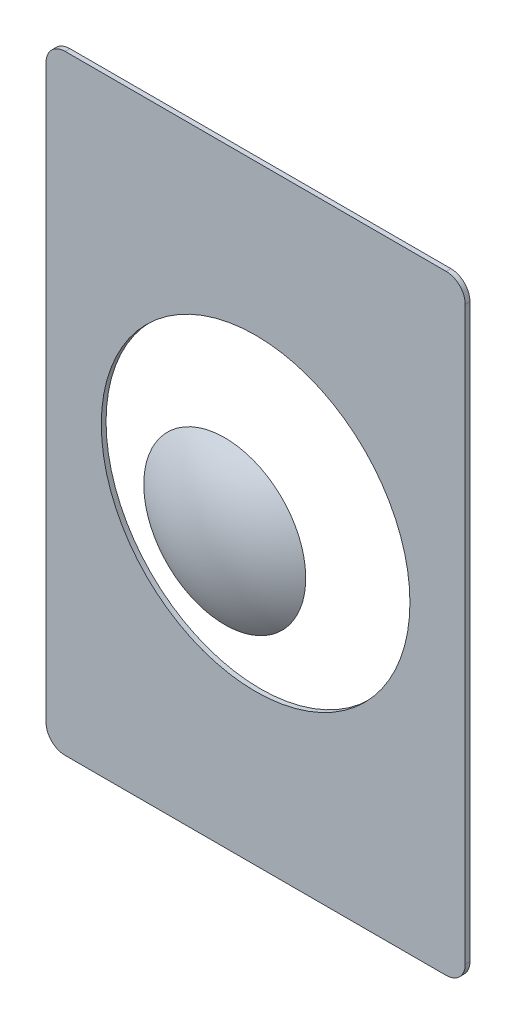
ISO-10303-21;
HEADER;
FILE_DESCRIPTION(('STEP AP214'),'2;1');
FILE_NAME('part.step','',(''),(''),'','','');
FILE_SCHEMA(('AUTOMOTIVE_DESIGN { 1 0 10303 214 1 1 1 1 }'));
ENDSEC;
DATA;
#1=APPLICATION_CONTEXT('core data for automotive mechanical design processes');
#2=APPLICATION_PROTOCOL_DEFINITION('international standard','automotive_design',2000,#1);
#3=PRODUCT_CONTEXT('',#1,'mechanical');
#4=PRODUCT('Part','Part','',(#3));
#5=PRODUCT_RELATED_PRODUCT_CATEGORY('part','',(#4));
#6=PRODUCT_DEFINITION_FORMATION('','',#4);
#7=PRODUCT_DEFINITION_CONTEXT('part definition',#1,'design');
#8=PRODUCT_DEFINITION('design','',#6,#7);
#9=PRODUCT_DEFINITION_SHAPE('','',#8);
#10=(LENGTH_UNIT() NAMED_UNIT(*) SI_UNIT(.MILLI.,.METRE.));
#11=(NAMED_UNIT(*) PLANE_ANGLE_UNIT() SI_UNIT($,.RADIAN.));
#12=(NAMED_UNIT(*) SI_UNIT($,.STERADIAN.) SOLID_ANGLE_UNIT());
#13=UNCERTAINTY_MEASURE_WITH_UNIT(LENGTH_MEASURE(1.E-05),#10,'distance_accuracy_value','');
#14=(GEOMETRIC_REPRESENTATION_CONTEXT(3) GLOBAL_UNCERTAINTY_ASSIGNED_CONTEXT((#13)) GLOBAL_UNIT_ASSIGNED_CONTEXT((#10,
#11,#12)) REPRESENTATION_CONTEXT('',''));
#15=CARTESIAN_POINT('',(0.,0.,0.));
#16=DIRECTION('',(0.,0.,1.));
#17=DIRECTION('',(1.,0.,0.));
#18=AXIS2_PLACEMENT_3D('',#15,#16,#17);
#19=CARTESIAN_POINT('',(56.999999845068,8.575004031758,0.571963767078));
#20=DIRECTION('',(0.,0.,-1.));
#21=DIRECTION('',(-1.,0.,0.));
#22=AXIS2_PLACEMENT_3D('',#19,#20,#21);
#23=PLANE('',#22);
#24=CARTESIAN_POINT('',(56.999999834932,9.42500403175785,0.571963767078002));
#25=CARTESIAN_POINT('',(56.9761411407142,9.42500207086063,0.571963767078125));
#26=CARTESIAN_POINT('',(56.9522607988355,9.42298756957891,0.571963767078101));
#27=CARTESIAN_POINT('',(56.9051372303346,9.41497322569739,0.571963767077899));
#28=CARTESIAN_POINT('',(56.8818954783837,9.40896485356885,0.571963767077719));
#29=CARTESIAN_POINT('',(56.8367896157025,9.39314177421923,0.571963767077767));
#30=CARTESIAN_POINT('',(56.8149231266397,9.3833338606323,0.571963767077994));
#31=CARTESIAN_POINT('',(56.7731164143787,9.36017191553272,0.571963767078006));
#32=CARTESIAN_POINT('',(56.7531789789575,9.34681285346851,0.571963767077792));
#33=CARTESIAN_POINT('',(56.715858133379,9.31695627620635,0.57196376707777));
#34=CARTESIAN_POINT('',(56.6984711615374,9.30046321297242,0.571963767077962));
#35=CARTESIAN_POINT('',(56.6666883958285,9.26476872042057,0.571963767078039));
#36=CARTESIAN_POINT('',(56.6522968233799,9.24556353198714,0.571963767077923));
#37=CARTESIAN_POINT('',(56.6269540245006,9.20502318314762,0.571963767077894));
#38=CARTESIAN_POINT('',(56.6160002999014,9.18368958431202,0.57196376707798));
#39=CARTESIAN_POINT('',(56.5978292625773,9.13948491669051,0.57196376707802));
#40=CARTESIAN_POINT('',(56.5906121696607,9.11661375754658,0.571963767077975));
#41=CARTESIAN_POINT('',(56.5801204378392,9.06998509477541,0.571963767077963));
#42=CARTESIAN_POINT('',(56.5768456830043,9.04622761723281,0.571963767077996));
#43=CARTESIAN_POINT('',(56.5743311912059,8.99850008006301,0.571963767078004));
#44=CARTESIAN_POINT('',(56.5750914542425,8.97453002043581,0.57196376707798));
#45=CARTESIAN_POINT('',(56.5806255075855,8.9270570504209,0.571963767077978));
#46=CARTESIAN_POINT('',(56.5853994159211,8.90355415379184,0.571963767077999));
#47=CARTESIAN_POINT('',(56.5988249688574,8.85768484198846,0.571963767078001));
#48=CARTESIAN_POINT('',(56.607476385372,8.83531836005313,0.571963767077983));
#49=CARTESIAN_POINT('',(56.628419033082,8.79233949494532,0.571963767077985));
#50=CARTESIAN_POINT('',(56.6407129127015,8.77172840219872,0.571963767078004));
#51=CARTESIAN_POINT('',(56.6685690639528,8.73289187516431,0.571963767077996));
#52=CARTESIAN_POINT('',(56.684126742539,8.71466314614486,0.571963767077969));
#53=CARTESIAN_POINT('',(56.7181037456573,8.68105029176419,0.57196376707798));
#54=CARTESIAN_POINT('',(56.7365270799551,8.66567021947045,0.571963767078018));
#55=CARTESIAN_POINT('',(56.7756685678935,8.63824357525651,0.571963767077982));
#56=CARTESIAN_POINT('',(56.796383420595,8.62619229356448,0.571963767077907));
#57=CARTESIAN_POINT('',(56.8395769407346,8.60571722320364,0.571963767077944));
#58=CARTESIAN_POINT('',(56.8620586871932,8.59729994065216,0.571963767078057));
#59=CARTESIAN_POINT('',(56.9080792613612,8.58437836298656,0.571963767077943));
#60=CARTESIAN_POINT('',(56.931615726306,8.5798657405163,0.571963767077718));
#61=CARTESIAN_POINT('',(56.9701757228216,8.57578821440278,0.571963767077791));
#62=CARTESIAN_POINT('',(56.9850835532725,8.57500280581868,0.571963767077925));
#63=CARTESIAN_POINT('',(57.0238585392858,8.57500599265536,0.571963767078124));
#64=CARTESIAN_POINT('',(57.0477388811645,8.57702049393708,0.5719637670781));
#65=CARTESIAN_POINT('',(57.0948624496654,8.58503483781861,0.5719637670779));
#66=CARTESIAN_POINT('',(57.1181042016163,8.59104320994716,0.571963767077724));
#67=CARTESIAN_POINT('',(57.1632100642975,8.60686628929678,0.571963767077772));
#68=CARTESIAN_POINT('',(57.1850765533603,8.6166742028837,0.571963767077995));
#69=CARTESIAN_POINT('',(57.2268832656213,8.63983614798329,0.571963767078005));
#70=CARTESIAN_POINT('',(57.2468207010425,8.6531952100475,0.571963767077793));
#71=CARTESIAN_POINT('',(57.284141546621,8.68305178730966,0.571963767077772));
#72=CARTESIAN_POINT('',(57.3015285184626,8.69954485054358,0.571963767077963));
#73=CARTESIAN_POINT('',(57.3333112841715,8.73523934309542,0.571963767078037));
#74=CARTESIAN_POINT('',(57.3477028566201,8.75444453152884,0.57196376707792));
#75=CARTESIAN_POINT('',(57.3730456554994,8.79498488036836,0.571963767077892));
#76=CARTESIAN_POINT('',(57.3839993800986,8.81631847920397,0.571963767077981));
#77=CARTESIAN_POINT('',(57.4021704174227,8.86052314682549,0.571963767078019));
#78=CARTESIAN_POINT('',(57.4093875103393,8.88339430596942,0.571963767077968));
#79=CARTESIAN_POINT('',(57.4198792421608,8.93002296874058,0.571963767077955));
#80=CARTESIAN_POINT('',(57.4231539969958,8.95378044628318,0.571963767077993));
#81=CARTESIAN_POINT('',(57.4256684887941,9.00150798345299,0.571963767078007));
#82=CARTESIAN_POINT('',(57.4249082257575,9.02547804308019,0.571963767077982));
#83=CARTESIAN_POINT('',(57.4193741724145,9.0729510130951,0.571963767077978));
#84=CARTESIAN_POINT('',(57.4146002640789,9.09645390972416,0.571963767077999));
#85=CARTESIAN_POINT('',(57.4011747111426,9.14232322152754,0.571963767078001));
#86=CARTESIAN_POINT('',(57.392523294628,9.16468970346287,0.571963767077983));
#87=CARTESIAN_POINT('',(57.371580646918,9.20766856857067,0.571963767077983));
#88=CARTESIAN_POINT('',(57.3592867672985,9.22827966131728,0.571963767078003));
#89=CARTESIAN_POINT('',(57.3314306160472,9.26711618835169,0.571963767077998));
#90=CARTESIAN_POINT('',(57.315872937461,9.28534491737114,0.571963767077973));
#91=CARTESIAN_POINT('',(57.2818959343428,9.31895777175181,0.571963767077984));
#92=CARTESIAN_POINT('',(57.2634726000449,9.33433784404554,0.571963767078019));
#93=CARTESIAN_POINT('',(57.2243311121065,9.36176448825948,0.571963767077981));
#94=CARTESIAN_POINT('',(57.203616259405,9.37381576995151,0.57196376707791));
#95=CARTESIAN_POINT('',(57.1604227392654,9.39429084031236,0.571963767077947));
#96=CARTESIAN_POINT('',(57.1379409928068,9.40270812286383,0.571963767078057));
#97=CARTESIAN_POINT('',(57.0919204186388,9.41562970052944,0.571963767077943));
#98=CARTESIAN_POINT('',(57.068383953694,9.4201423229997,0.571963767077719));
#99=CARTESIAN_POINT('',(57.0298239571785,9.42421984911322,0.571963767077792));
#100=CARTESIAN_POINT('',(57.0149161267275,9.42500525769732,0.571963767077926));
#101=CARTESIAN_POINT('',(56.999999834932,9.42500403175785,0.571963767078002));
#102=B_SPLINE_CURVE_WITH_KNOTS('',3,(#24,#25,#26,#27,#28,#29,#30,#31,#32,#33,#34,#35,#36,#37,
#38,#39,#40,#41,#42,#43,#44,#45,#46,#47,#48,#49,#50,#51,#52,#53,#54,#55,#56,#57,#58,#59,#60,#61,
#62,#63,#64,#65,#66,#67,#68,#69,#70,#71,#72,#73,#74,#75,#76,#77,#78,#79,#80,#81,#82,#83,#84,#85,
#86,#87,#88,#89,#90,#91,#92,#93,#94,#95,#96,#97,#98,#99,#100,#101),.UNSPECIFIED.,.T.,.F.,(4,2,2,
2,2,2,2,2,2,2,2,2,2,2,2,2,2,2,2,2,2,2,2,2,2,2,2,2,2,2,2,2,2,2,2,2,2,2,4),(0.,0.071529326662966,
0.143211908184614,0.214766907431561,0.286423816615128,0.357979685361518,0.429635725050617,
0.501239573493076,0.572847633573875,0.644453587867279,0.716059542160699,0.787667602241441,
0.859271450683884,0.930927490372848,1.00248335911918,1.07414026830285,1.14569526754987,
1.2173778490717,1.28890717573465,1.33362681959682,1.40515614625979,1.47683872778144,
1.54839372702839,1.62005063621196,1.69160650495834,1.76326254464743,1.8348663930899,
1.9064744531707,1.9780804074641,2.04968636175753,2.12129442183827,2.19289827028071,
2.26455430996967,2.33611017871601,2.40776708789967,2.47932208714669,2.55100466866852,
2.62253399533147,2.66725363919365),.UNSPECIFIED.);
#103=CARTESIAN_POINT('',(56.999999834932,9.42500403175785,0.571963767078002));
#104=VERTEX_POINT('',#103);
#105=EDGE_CURVE('P0_E10',#104,#104,#102,.T.);
#106=ORIENTED_EDGE('',*,*,#105,.F.);
#107=EDGE_LOOP('',(#106));
#108=FACE_BOUND('',#107,.T.);
#109=ADVANCED_FACE('P0_F15',(#108),#23,.T.);
#110=CARTESIAN_POINT('',(56.99999984,9.000004031758,-0.06938485475814));
#111=DIRECTION('',(1.19248806385E-08,-1.,0.));
#112=DIRECTION('',(1.,1.19248806385E-08,0.));
#113=AXIS2_PLACEMENT_3D('',#110,#111,#112);
#114=SPHERICAL_SURFACE('',#113,0.769384854758);
#115=ORIENTED_EDGE('',*,*,#105,.T.);
#116=EDGE_LOOP('',(#115));
#117=FACE_BOUND('',#116,.T.);
#118=ADVANCED_FACE('P0_F27',(#117),#114,.T.);
#119=CLOSED_SHELL('',(#109,#118));
#120=MANIFOLD_SOLID_BREP('P0_B1',#119);
#121=CARTESIAN_POINT('',(56.99999984,9.000004031758,0.41));
#122=DIRECTION('',(0.,0.,1.));
#123=DIRECTION('',(1.,0.,0.));
#124=AXIS2_PLACEMENT_3D('',#121,#122,#123);
#125=PLANE('',#124);
#126=CARTESIAN_POINT('',(56.99999984,9.000004031758,0.41));
#127=DIRECTION('',(0.,0.,1.));
#128=DIRECTION('',(1.,0.,0.));
#129=AXIS2_PLACEMENT_3D('',#126,#127,#128);
#130=CIRCLE('',#129,0.809908151923);
#131=CARTESIAN_POINT('',(57.809907991923,9.000004031758,0.41));
#132=VERTEX_POINT('',#131);
#133=EDGE_CURVE('P1_E128',#132,#132,#130,.F.);
#134=ORIENTED_EDGE('',*,*,#133,.T.);
#135=EDGE_LOOP('',(#134));
#136=FACE_BOUND('',#135,.T.);
#137=DIRECTION('',(-1.,-1.192488077728E-08,0.));
#138=VECTOR('',#137,1.);
#139=CARTESIAN_POINT('',(57.999999820923,10.6000040437,0.41));
#140=LINE('',#139,#138);
#141=CARTESIAN_POINT('',(55.9999998209173,10.6000040198501,0.41));
#142=VERTEX_POINT('',#141);
#143=CARTESIAN_POINT('',(57.9999998209233,10.6000040437,0.41));
#144=VERTEX_POINT('',#143);
#145=EDGE_CURVE('P1_E108',#142,#144,#140,.F.);
#146=ORIENTED_EDGE('',*,*,#145,.F.);
#147=CARTESIAN_POINT('',(55.99999982211,10.50000401985,0.41));
#148=DIRECTION('',(0.,0.,1.));
#149=DIRECTION('',(1.,0.,0.));
#150=AXIS2_PLACEMENT_3D('',#147,#148,#149);
#151=CIRCLE('',#150,0.1);
#152=CARTESIAN_POINT('',(55.89999982211,10.5000040186578,0.41));
#153=VERTEX_POINT('',#152);
#154=EDGE_CURVE('P1_E131',#153,#142,#151,.F.);
#155=ORIENTED_EDGE('',*,*,#154,.F.);
#156=DIRECTION('',(1.19248806385E-08,-1.,0.));
#157=VECTOR('',#156,1.);
#158=CARTESIAN_POINT('',(55.89999982211,10.500004018658,0.41));
#159=LINE('',#158,#157);
#160=CARTESIAN_POINT('',(55.8999998578846,7.50000401862276,0.41));
#161=VERTEX_POINT('',#160);
#162=EDGE_CURVE('P1_E94',#161,#153,#159,.F.);
#163=ORIENTED_EDGE('',*,*,#162,.F.);
#164=CARTESIAN_POINT('',(55.999999857884,7.500004019815,0.41));
#165=DIRECTION('',(0.,0.,1.));
#166=DIRECTION('',(1.,0.,0.));
#167=AXIS2_PLACEMENT_3D('',#164,#165,#166);
#168=CIRCLE('',#167,0.1);
#169=CARTESIAN_POINT('',(55.9999998590768,7.400004019815,0.41));
#170=VERTEX_POINT('',#169);
#171=EDGE_CURVE('P1_E20',#170,#161,#168,.F.);
#172=ORIENTED_EDGE('',*,*,#171,.F.);
#173=DIRECTION('',(1.,1.19248806385E-08,0.));
#174=VECTOR('',#173,1.);
#175=CARTESIAN_POINT('',(55.999999859077,7.400004019815,0.41));
#176=LINE('',#175,#174);
#177=CARTESIAN_POINT('',(57.9999998590827,7.40000404366488,0.41));
#178=VERTEX_POINT('',#177);
#179=EDGE_CURVE('P1_E79',#178,#170,#176,.F.);
#180=ORIENTED_EDGE('',*,*,#179,.F.);
#181=CARTESIAN_POINT('',(57.99999985789,7.500004043665,0.41));
#182=DIRECTION('',(0.,0.,1.));
#183=DIRECTION('',(1.,0.,0.));
#184=AXIS2_PLACEMENT_3D('',#181,#182,#183);
#185=CIRCLE('',#184,0.1);
#186=CARTESIAN_POINT('',(58.09999985789,7.50000404485774,0.41));
#187=VERTEX_POINT('',#186);
#188=EDGE_CURVE('P1_E101',#187,#178,#185,.F.);
#189=ORIENTED_EDGE('',*,*,#188,.F.);
#190=DIRECTION('',(-1.192488059224E-08,1.,0.));
#191=VECTOR('',#190,1.);
#192=CARTESIAN_POINT('',(58.09999985789,7.500004044858,0.41));
#193=LINE('',#192,#191);
#194=CARTESIAN_POINT('',(58.0999998221157,10.5000040442962,0.41));
#195=VERTEX_POINT('',#194);
#196=EDGE_CURVE('P1_E112',#195,#187,#193,.F.);
#197=ORIENTED_EDGE('',*,*,#196,.F.);
#198=CARTESIAN_POINT('',(57.999999822116,10.5000040437,0.41));
#199=DIRECTION('',(0.,0.,1.));
#200=DIRECTION('',(1.,0.,0.));
#201=AXIS2_PLACEMENT_3D('',#198,#199,#200);
#202=CIRCLE('',#201,0.1);
#203=EDGE_CURVE('P1_E134',#144,#195,#202,.F.);
#204=ORIENTED_EDGE('',*,*,#203,.F.);
#205=EDGE_LOOP('',(#146,#155,#163,#172,#180,#189,#197,#204));
#206=FACE_BOUND('',#205,.T.);
#207=ADVANCED_FACE('P1_F17',(#136,#206),#125,.T.);
#208=CARTESIAN_POINT('',(55.999999857884,7.500004019815,0.385));
#209=DIRECTION('',(0.,0.,1.));
#210=DIRECTION('',(1.,0.,0.));
#211=AXIS2_PLACEMENT_3D('',#208,#209,#210);
#212=CYLINDRICAL_SURFACE('',#211,0.1);
#213=ORIENTED_EDGE('',*,*,#171,.T.);
#214=DIRECTION('',(0.,0.,1.));
#215=VECTOR('',#214,1.);
#216=CARTESIAN_POINT('',(55.8999998578846,7.500004018623,0.385));
#217=LINE('',#216,#215);
#218=CARTESIAN_POINT('',(55.8999998399973,7.500004019219,0.385));
#219=VERTEX_POINT('',#218);
#220=EDGE_CURVE('P1_E107',#219,#161,#217,.T.);
#221=ORIENTED_EDGE('',*,*,#220,.F.);
#222=CARTESIAN_POINT('',(55.999999857884,7.500004019815,0.385));
#223=DIRECTION('',(0.,0.,1.));
#224=DIRECTION('',(1.,0.,0.));
#225=AXIS2_PLACEMENT_3D('',#222,#223,#224);
#226=CIRCLE('',#225,0.1);
#227=CARTESIAN_POINT('',(55.9999998584805,7.400004019815,0.385));
#228=VERTEX_POINT('',#227);
#229=EDGE_CURVE('P1_E100',#219,#228,#226,.T.);
#230=ORIENTED_EDGE('',*,*,#229,.T.);
#231=DIRECTION('',(0.,0.,1.));
#232=VECTOR('',#231,1.);
#233=CARTESIAN_POINT('',(55.999999859077,7.400004019815,0.385));
#234=LINE('',#233,#232);
#235=EDGE_CURVE('P1_E84',#170,#228,#234,.F.);
#236=ORIENTED_EDGE('',*,*,#235,.F.);
#237=EDGE_LOOP('',(#213,#221,#230,#236));
#238=FACE_BOUND('',#237,.T.);
#239=ADVANCED_FACE('P1_F99',(#238),#212,.T.);
#240=CARTESIAN_POINT('',(55.999999859077,7.400004019815,0.385));
#241=DIRECTION('',(1.19248806385E-08,-1.,0.));
#242=DIRECTION('',(1.,1.19248806385E-08,0.));
#243=AXIS2_PLACEMENT_3D('',#240,#241,#242);
#244=PLANE('',#243);
#245=ORIENTED_EDGE('',*,*,#179,.T.);
#246=ORIENTED_EDGE('',*,*,#235,.T.);
#247=DIRECTION('',(1.,0.,0.));
#248=VECTOR('',#247,1.);
#249=CARTESIAN_POINT('',(56.99999984,7.400004019815,0.385));
#250=LINE('',#249,#248);
#251=CARTESIAN_POINT('',(57.9999998584865,7.40000403174,0.385));
#252=VERTEX_POINT('',#251);
#253=EDGE_CURVE('P1_E126',#228,#252,#250,.T.);
#254=ORIENTED_EDGE('',*,*,#253,.T.);
#255=DIRECTION('',(0.,0.,1.));
#256=VECTOR('',#255,1.);
#257=CARTESIAN_POINT('',(57.999999859083,7.400004043665,0.385));
#258=LINE('',#257,#256);
#259=EDGE_CURVE('P1_E86',#178,#252,#258,.F.);
#260=ORIENTED_EDGE('',*,*,#259,.F.);
#261=EDGE_LOOP('',(#245,#246,#254,#260));
#262=FACE_BOUND('',#261,.T.);
#263=ADVANCED_FACE('P1_F81',(#262),#244,.T.);
#264=CARTESIAN_POINT('',(57.99999985789,7.500004043665,0.385));
#265=DIRECTION('',(0.,0.,1.));
#266=DIRECTION('',(1.,0.,0.));
#267=AXIS2_PLACEMENT_3D('',#264,#265,#266);
#268=CYLINDRICAL_SURFACE('',#267,0.1);
#269=ORIENTED_EDGE('',*,*,#188,.T.);
#270=ORIENTED_EDGE('',*,*,#259,.T.);
#271=CARTESIAN_POINT('',(57.99999985789,7.500004043665,0.385));
#272=DIRECTION('',(0.,0.,1.));
#273=DIRECTION('',(1.,0.,0.));
#274=AXIS2_PLACEMENT_3D('',#271,#272,#273);
#275=CIRCLE('',#274,0.1);
#276=CARTESIAN_POINT('',(58.09999985789,7.5000040442615,0.385));
#277=VERTEX_POINT('',#276);
#278=EDGE_CURVE('P1_E123',#252,#277,#275,.T.);
#279=ORIENTED_EDGE('',*,*,#278,.T.);
#280=DIRECTION('',(0.,0.,1.));
#281=VECTOR('',#280,1.);
#282=CARTESIAN_POINT('',(58.09999985789,7.500004044858,0.385));
#283=LINE('',#282,#281);
#284=EDGE_CURVE('P1_E113',#187,#277,#283,.F.);
#285=ORIENTED_EDGE('',*,*,#284,.F.);
#286=EDGE_LOOP('',(#269,#270,#279,#285));
#287=FACE_BOUND('',#286,.T.);
#288=ADVANCED_FACE('P1_F169',(#287),#268,.T.);
#289=CARTESIAN_POINT('',(58.09999985789,7.500004044858,0.385));
#290=DIRECTION('',(1.,1.192488059224E-08,0.));
#291=DIRECTION('',(-1.192488059224E-08,1.,0.));
#292=AXIS2_PLACEMENT_3D('',#289,#290,#291);
#293=PLANE('',#292);
#294=ORIENTED_EDGE('',*,*,#196,.T.);
#295=ORIENTED_EDGE('',*,*,#284,.T.);
#296=DIRECTION('',(0.,1.,0.));
#297=VECTOR('',#296,1.);
#298=CARTESIAN_POINT('',(58.09999985789,9.000004031758,0.385));
#299=LINE('',#298,#297);
#300=CARTESIAN_POINT('',(58.099999840003,10.5000040437,0.385));
#301=VERTEX_POINT('',#300);
#302=EDGE_CURVE('P1_E122',#277,#301,#299,.T.);
#303=ORIENTED_EDGE('',*,*,#302,.T.);
#304=DIRECTION('',(0.,0.,1.));
#305=VECTOR('',#304,1.);
#306=CARTESIAN_POINT('',(58.099999822116,10.5000040437,0.385));
#307=LINE('',#306,#305);
#308=EDGE_CURVE('P1_E111',#195,#301,#307,.F.);
#309=ORIENTED_EDGE('',*,*,#308,.F.);
#310=EDGE_LOOP('',(#294,#295,#303,#309));
#311=FACE_BOUND('',#310,.T.);
#312=ADVANCED_FACE('P1_F166',(#311),#293,.T.);
#313=CARTESIAN_POINT('',(57.999999822116,10.5000040437,0.385));
#314=DIRECTION('',(0.,0.,1.));
#315=DIRECTION('',(1.,0.,0.));
#316=AXIS2_PLACEMENT_3D('',#313,#314,#315);
#317=CYLINDRICAL_SURFACE('',#316,0.1);
#318=ORIENTED_EDGE('',*,*,#203,.T.);
#319=ORIENTED_EDGE('',*,*,#308,.T.);
#320=CARTESIAN_POINT('',(57.999999822116,10.5000040437,0.385));
#321=DIRECTION('',(0.,0.,1.));
#322=DIRECTION('',(1.,0.,0.));
#323=AXIS2_PLACEMENT_3D('',#320,#321,#322);
#324=CIRCLE('',#323,0.1);
#325=CARTESIAN_POINT('',(57.9999998215195,10.6000040437,0.385));
#326=VERTEX_POINT('',#325);
#327=EDGE_CURVE('P1_E119',#301,#326,#324,.T.);
#328=ORIENTED_EDGE('',*,*,#327,.T.);
#329=DIRECTION('',(0.,0.,1.));
#330=VECTOR('',#329,1.);
#331=CARTESIAN_POINT('',(57.999999820923,10.6000040437,0.385));
#332=LINE('',#331,#330);
#333=EDGE_CURVE('P1_E110',#144,#326,#332,.F.);
#334=ORIENTED_EDGE('',*,*,#333,.F.);
#335=EDGE_LOOP('',(#318,#319,#328,#334));
#336=FACE_BOUND('',#335,.T.);
#337=ADVANCED_FACE('P1_F164',(#336),#317,.T.);
#338=CARTESIAN_POINT('',(57.999999820923,10.6000040437,0.385));
#339=DIRECTION('',(-1.192488077728E-08,1.,0.));
#340=DIRECTION('',(-1.,-1.192488077728E-08,0.));
#341=AXIS2_PLACEMENT_3D('',#338,#339,#340);
#342=PLANE('',#341);
#343=ORIENTED_EDGE('',*,*,#145,.T.);
#344=ORIENTED_EDGE('',*,*,#333,.T.);
#345=DIRECTION('',(1.,0.,0.));
#346=VECTOR('',#345,1.);
#347=CARTESIAN_POINT('',(56.99999984,10.6000040437,0.385));
#348=LINE('',#347,#346);
#349=CARTESIAN_POINT('',(55.9999998215135,10.600004031775,0.385));
#350=VERTEX_POINT('',#349);
#351=EDGE_CURVE('P1_E118',#326,#350,#348,.F.);
#352=ORIENTED_EDGE('',*,*,#351,.T.);
#353=DIRECTION('',(0.,0.,1.));
#354=VECTOR('',#353,1.);
#355=CARTESIAN_POINT('',(55.999999820917,10.60000401985,0.385));
#356=LINE('',#355,#354);
#357=EDGE_CURVE('P1_E133',#142,#350,#356,.F.);
#358=ORIENTED_EDGE('',*,*,#357,.F.);
#359=EDGE_LOOP('',(#343,#344,#352,#358));
#360=FACE_BOUND('',#359,.T.);
#361=ADVANCED_FACE('P1_F162',(#360),#342,.T.);
#362=CARTESIAN_POINT('',(55.99999982211,10.50000401985,0.385));
#363=DIRECTION('',(0.,0.,1.));
#364=DIRECTION('',(1.,0.,0.));
#365=AXIS2_PLACEMENT_3D('',#362,#363,#364);
#366=CYLINDRICAL_SURFACE('',#365,0.1);
#367=ORIENTED_EDGE('',*,*,#154,.T.);
#368=ORIENTED_EDGE('',*,*,#357,.T.);
#369=CARTESIAN_POINT('',(55.99999982211,10.50000401985,0.385));
#370=DIRECTION('',(0.,0.,1.));
#371=DIRECTION('',(1.,0.,0.));
#372=AXIS2_PLACEMENT_3D('',#369,#370,#371);
#373=CIRCLE('',#372,0.1);
#374=CARTESIAN_POINT('',(55.89999982211,10.500004019254,0.385));
#375=VERTEX_POINT('',#374);
#376=EDGE_CURVE('P1_E115',#350,#375,#373,.T.);
#377=ORIENTED_EDGE('',*,*,#376,.T.);
#378=DIRECTION('',(0.,0.,1.));
#379=VECTOR('',#378,1.);
#380=CARTESIAN_POINT('',(55.89999982211,10.500004018658,0.385));
#381=LINE('',#380,#379);
#382=EDGE_CURVE('P1_E35',#153,#375,#381,.F.);
#383=ORIENTED_EDGE('',*,*,#382,.F.);
#384=EDGE_LOOP('',(#367,#368,#377,#383));
#385=FACE_BOUND('',#384,.T.);
#386=ADVANCED_FACE('P1_F159',(#385),#366,.T.);
#387=CARTESIAN_POINT('',(55.89999982211,10.500004018658,0.385));
#388=DIRECTION('',(-1.,-1.19248806385E-08,0.));
#389=DIRECTION('',(1.19248806385E-08,-1.,0.));
#390=AXIS2_PLACEMENT_3D('',#387,#388,#389);
#391=PLANE('',#390);
#392=ORIENTED_EDGE('',*,*,#162,.T.);
#393=ORIENTED_EDGE('',*,*,#382,.T.);
#394=DIRECTION('',(0.,1.,0.));
#395=VECTOR('',#394,1.);
#396=CARTESIAN_POINT('',(55.89999982211,9.000004031758,0.385));
#397=LINE('',#396,#395);
#398=EDGE_CURVE('P1_E26',#375,#219,#397,.F.);
#399=ORIENTED_EDGE('',*,*,#398,.T.);
#400=ORIENTED_EDGE('',*,*,#220,.T.);
#401=EDGE_LOOP('',(#392,#393,#399,#400));
#402=FACE_BOUND('',#401,.T.);
#403=ADVANCED_FACE('P1_F153',(#402),#391,.T.);
#404=CARTESIAN_POINT('',(56.99999984,9.000004031758,0.385));
#405=DIRECTION('',(0.,0.,1.));
#406=DIRECTION('',(1.,0.,0.));
#407=AXIS2_PLACEMENT_3D('',#404,#405,#406);
#408=CYLINDRICAL_SURFACE('',#407,0.809908151923);
#409=CARTESIAN_POINT('',(56.99999984,9.000004031758,0.385));
#410=DIRECTION('',(0.,0.,1.));
#411=DIRECTION('',(1.,0.,0.));
#412=AXIS2_PLACEMENT_3D('',#409,#410,#411);
#413=CIRCLE('',#412,0.809908151923);
#414=CARTESIAN_POINT('',(57.809907991923,9.000004031758,0.385));
#415=VERTEX_POINT('',#414);
#416=EDGE_CURVE('P1_E11',#415,#415,#413,.F.);
#417=ORIENTED_EDGE('',*,*,#416,.T.);
#418=EDGE_LOOP('',(#417));
#419=FACE_BOUND('',#418,.T.);
#420=ORIENTED_EDGE('',*,*,#133,.F.);
#421=EDGE_LOOP('',(#420));
#422=FACE_BOUND('',#421,.T.);
#423=ADVANCED_FACE('P1_F180',(#419,#422),#408,.F.);
#424=CARTESIAN_POINT('',(56.99999984,9.000004031758,0.385));
#425=DIRECTION('',(0.,0.,1.));
#426=DIRECTION('',(1.,0.,0.));
#427=AXIS2_PLACEMENT_3D('',#424,#425,#426);
#428=PLANE('',#427);
#429=ORIENTED_EDGE('',*,*,#416,.F.);
#430=EDGE_LOOP('',(#429));
#431=FACE_BOUND('',#430,.T.);
#432=ORIENTED_EDGE('',*,*,#376,.F.);
#433=ORIENTED_EDGE('',*,*,#351,.F.);
#434=ORIENTED_EDGE('',*,*,#327,.F.);
#435=ORIENTED_EDGE('',*,*,#302,.F.);
#436=ORIENTED_EDGE('',*,*,#278,.F.);
#437=ORIENTED_EDGE('',*,*,#253,.F.);
#438=ORIENTED_EDGE('',*,*,#229,.F.);
#439=ORIENTED_EDGE('',*,*,#398,.F.);
#440=EDGE_LOOP('',(#432,#433,#434,#435,#436,#437,#438,#439));
#441=FACE_BOUND('',#440,.T.);
#442=ADVANCED_FACE('P1_F156',(#431,#441),#428,.F.);
#443=CLOSED_SHELL('',(#207,#239,#263,#288,#312,#337,#361,#386,#403,#423,#442));
#444=MANIFOLD_SOLID_BREP('P1_B1',#443);
#445=ADVANCED_BREP_SHAPE_REPRESENTATION('',(#18,#120,#444),#14);
#446=SHAPE_DEFINITION_REPRESENTATION(#9,#445);
ENDSEC;
END-ISO-10303-21;
